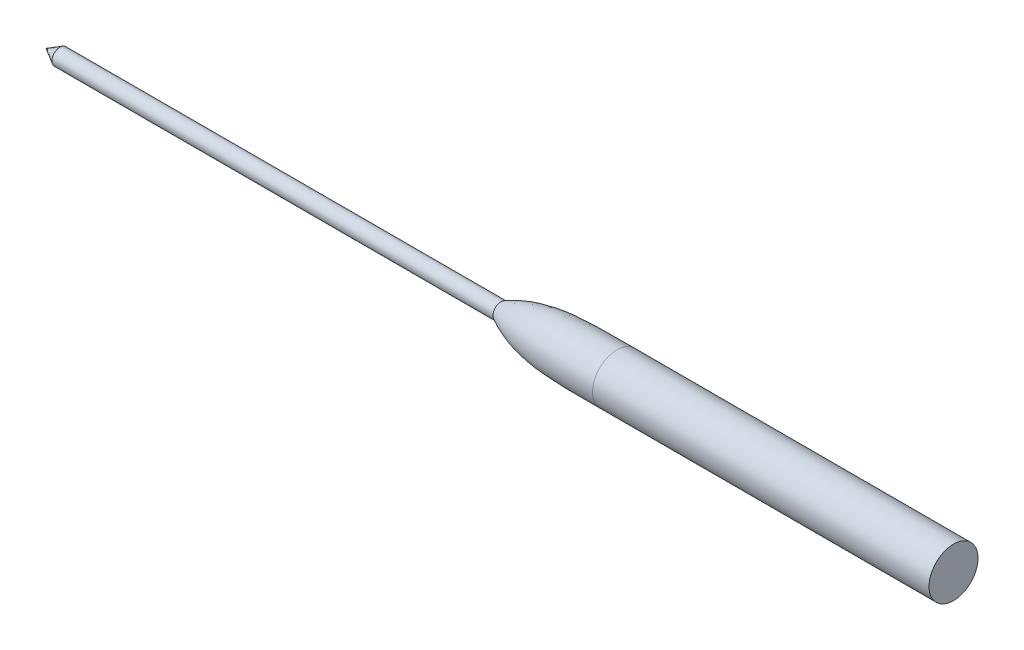
ISO-10303-21;
HEADER;
FILE_DESCRIPTION(('STEP AP214'),'2;1');
FILE_NAME('part.step','',(''),(''),'','','');
FILE_SCHEMA(('AUTOMOTIVE_DESIGN { 1 0 10303 214 1 1 1 1 }'));
ENDSEC;
DATA;
#1=APPLICATION_CONTEXT('core data for automotive mechanical design processes');
#2=APPLICATION_PROTOCOL_DEFINITION('international standard','automotive_design',2000,#1);
#3=PRODUCT_CONTEXT('',#1,'mechanical');
#4=PRODUCT('Part','Part','',(#3));
#5=PRODUCT_RELATED_PRODUCT_CATEGORY('part','',(#4));
#6=PRODUCT_DEFINITION_FORMATION('','',#4);
#7=PRODUCT_DEFINITION_CONTEXT('part definition',#1,'design');
#8=PRODUCT_DEFINITION('design','',#6,#7);
#9=PRODUCT_DEFINITION_SHAPE('','',#8);
#10=(LENGTH_UNIT() NAMED_UNIT(*) SI_UNIT(.MILLI.,.METRE.));
#11=(NAMED_UNIT(*) PLANE_ANGLE_UNIT() SI_UNIT($,.RADIAN.));
#12=(NAMED_UNIT(*) SI_UNIT($,.STERADIAN.) SOLID_ANGLE_UNIT());
#13=UNCERTAINTY_MEASURE_WITH_UNIT(LENGTH_MEASURE(1.E-05),#10,'distance_accuracy_value','');
#14=(GEOMETRIC_REPRESENTATION_CONTEXT(3) GLOBAL_UNCERTAINTY_ASSIGNED_CONTEXT((#13)) GLOBAL_UNIT_ASSIGNED_CONTEXT((#10,
#11,#12)) REPRESENTATION_CONTEXT('',''));
#15=CARTESIAN_POINT('',(0.,0.,0.));
#16=DIRECTION('',(0.,0.,1.));
#17=DIRECTION('',(1.,0.,0.));
#18=AXIS2_PLACEMENT_3D('',#15,#16,#17);
#19=CARTESIAN_POINT('',(0.,0.,19.));
#20=DIRECTION('',(-1.,0.,0.));
#21=DIRECTION('',(0.,0.,1.));
#22=AXIS2_PLACEMENT_3D('',#19,#20,#21);
#23=PLANE('',#22);
#24=CARTESIAN_POINT('',(0.,0.,19.));
#25=DIRECTION('',(-1.,0.,0.));
#26=DIRECTION('',(0.,0.,1.));
#27=AXIS2_PLACEMENT_3D('',#24,#25,#26);
#28=CIRCLE('',#27,19.);
#29=CARTESIAN_POINT('',(0.,0.,38.));
#30=VERTEX_POINT('',#29);
#31=EDGE_CURVE('E11',#30,#30,#28,.T.);
#32=ORIENTED_EDGE('',*,*,#31,.F.);
#33=EDGE_LOOP('',(#32));
#34=FACE_BOUND('',#33,.T.);
#35=ADVANCED_FACE('F33',(#34),#23,.F.);
#36=CARTESIAN_POINT('',(-703.825317547306,0.,19.0000000000002));
#37=DIRECTION('',(-1.,0.,0.));
#38=DIRECTION('',(0.,0.,1.));
#39=AXIS2_PLACEMENT_3D('',#36,#37,#38);
#40=CYLINDRICAL_SURFACE('',#39,19.);
#41=CARTESIAN_POINT('',(-261.,0.,19.0000000000001));
#42=DIRECTION('',(-1.,0.,0.));
#43=DIRECTION('',(0.,0.,1.));
#44=AXIS2_PLACEMENT_3D('',#41,#42,#43);
#45=CIRCLE('',#44,19.);
#46=CARTESIAN_POINT('',(-261.,0.,38.0000000000001));
#47=VERTEX_POINT('',#46);
#48=EDGE_CURVE('E39',#47,#47,#45,.T.);
#49=ORIENTED_EDGE('',*,*,#48,.F.);
#50=EDGE_LOOP('',(#49));
#51=FACE_BOUND('',#50,.T.);
#52=ORIENTED_EDGE('',*,*,#31,.T.);
#53=EDGE_LOOP('',(#52));
#54=FACE_BOUND('',#53,.T.);
#55=ADVANCED_FACE('F64',(#51,#54),#40,.T.);
#56=CARTESIAN_POINT('',(-261.,0.,0.));
#57=CARTESIAN_POINT('',(-291.112694808154,0.,0.));
#58=CARTESIAN_POINT('',(-323.638894203519,0.,-1.87634011567153));
#59=CARTESIAN_POINT('',(-351.,0.,12.7500000000001));
#60=B_SPLINE_CURVE_WITH_KNOTS('',3,(#56,#57,#58,#59),.UNSPECIFIED.,.F.,.F.,(4,4),(0.,1.),.UNSPECIFIED.);
#61=CARTESIAN_POINT('',(-703.825317547306,0.,19.0000000000002));
#62=DIRECTION('',(-1.,0.,0.));
#63=AXIS1_PLACEMENT('',#61,#62);
#64=SURFACE_OF_REVOLUTION('',#60,#63);
#65=CARTESIAN_POINT('',(-351.,0.,19.0000000000001));
#66=DIRECTION('',(-1.,0.,0.));
#67=DIRECTION('',(0.,0.,1.));
#68=AXIS2_PLACEMENT_3D('',#65,#66,#67);
#69=CIRCLE('',#68,6.25);
#70=CARTESIAN_POINT('',(-351.,0.,25.2500000000001));
#71=VERTEX_POINT('',#70);
#72=EDGE_CURVE('E51',#71,#71,#69,.T.);
#73=ORIENTED_EDGE('',*,*,#72,.F.);
#74=EDGE_LOOP('',(#73));
#75=FACE_BOUND('',#74,.T.);
#76=ORIENTED_EDGE('',*,*,#48,.T.);
#77=EDGE_LOOP('',(#76));
#78=FACE_BOUND('',#77,.T.);
#79=ADVANCED_FACE('F62',(#75,#78),#64,.T.);
#80=CARTESIAN_POINT('',(-703.825317547306,0.,19.0000000000002));
#81=DIRECTION('',(-1.,0.,0.));
#82=DIRECTION('',(0.,0.,1.));
#83=AXIS2_PLACEMENT_3D('',#80,#81,#82);
#84=CYLINDRICAL_SURFACE('',#83,6.24999999999998);
#85=CARTESIAN_POINT('',(-693.,0.,19.0000000000002));
#86=DIRECTION('',(-1.,0.,0.));
#87=DIRECTION('',(0.,0.,1.));
#88=AXIS2_PLACEMENT_3D('',#85,#86,#87);
#89=CIRCLE('',#88,6.24999999999996);
#90=CARTESIAN_POINT('',(-693.,0.,25.2500000000001));
#91=VERTEX_POINT('',#90);
#92=EDGE_CURVE('E49',#91,#91,#89,.T.);
#93=ORIENTED_EDGE('',*,*,#92,.F.);
#94=EDGE_LOOP('',(#93));
#95=FACE_BOUND('',#94,.T.);
#96=ORIENTED_EDGE('',*,*,#72,.T.);
#97=EDGE_LOOP('',(#96));
#98=FACE_BOUND('',#97,.T.);
#99=ADVANCED_FACE('F45',(#95,#98),#84,.T.);
#100=CARTESIAN_POINT('',(-693.,0.,19.0000000000002));
#101=DIRECTION('',(1.,0.,0.));
#102=DIRECTION('',(0.,0.,-1.));
#103=AXIS2_PLACEMENT_3D('',#100,#101,#102);
#104=CONICAL_SURFACE('',#103,6.24999999999996,0.523598775598285);
#105=CARTESIAN_POINT('',(-703.825317547306,0.,19.0000000000002));
#106=VERTEX_POINT('',#105);
#107=VERTEX_LOOP('',#106);
#108=FACE_BOUND('',#107,.T.);
#109=ORIENTED_EDGE('',*,*,#92,.T.);
#110=EDGE_LOOP('',(#109));
#111=FACE_BOUND('',#110,.T.);
#112=ADVANCED_FACE('F42',(#108,#111),#104,.T.);
#113=CLOSED_SHELL('',(#35,#55,#79,#99,#112));
#114=MANIFOLD_SOLID_BREP('B2',#113);
#115=ADVANCED_BREP_SHAPE_REPRESENTATION('',(#18,#114),#14);
#116=SHAPE_DEFINITION_REPRESENTATION(#9,#115);
ENDSEC;
END-ISO-10303-21;
